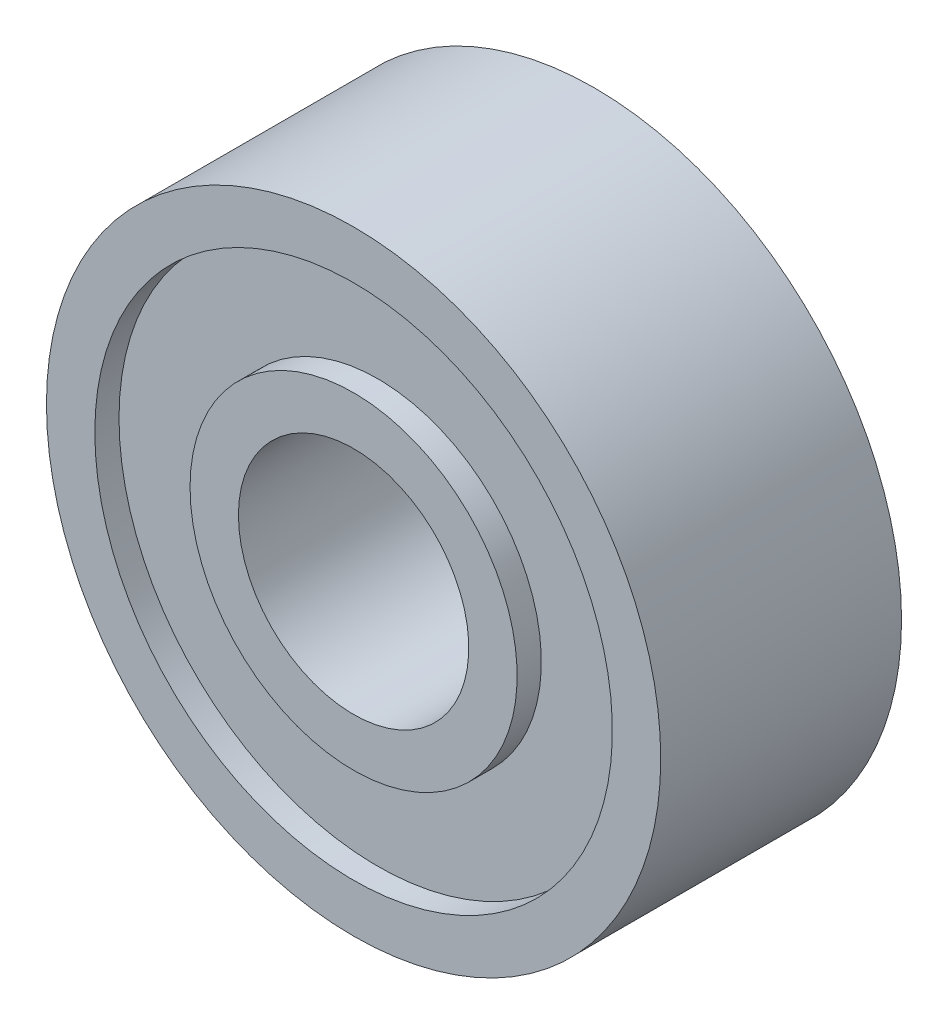
ISO-10303-21;
HEADER;
FILE_DESCRIPTION(('STEP AP214'),'2;1');
FILE_NAME('part.step','',(''),(''),'','','');
FILE_SCHEMA(('AUTOMOTIVE_DESIGN { 1 0 10303 214 1 1 1 1 }'));
ENDSEC;
DATA;
#1=APPLICATION_CONTEXT('core data for automotive mechanical design processes');
#2=APPLICATION_PROTOCOL_DEFINITION('international standard','automotive_design',2000,#1);
#3=PRODUCT_CONTEXT('',#1,'mechanical');
#4=PRODUCT('Part','Part','',(#3));
#5=PRODUCT_RELATED_PRODUCT_CATEGORY('part','',(#4));
#6=PRODUCT_DEFINITION_FORMATION('','',#4);
#7=PRODUCT_DEFINITION_CONTEXT('part definition',#1,'design');
#8=PRODUCT_DEFINITION('design','',#6,#7);
#9=PRODUCT_DEFINITION_SHAPE('','',#8);
#10=(LENGTH_UNIT() NAMED_UNIT(*) SI_UNIT(.MILLI.,.METRE.));
#11=(NAMED_UNIT(*) PLANE_ANGLE_UNIT() SI_UNIT($,.RADIAN.));
#12=(NAMED_UNIT(*) SI_UNIT($,.STERADIAN.) SOLID_ANGLE_UNIT());
#13=UNCERTAINTY_MEASURE_WITH_UNIT(LENGTH_MEASURE(1.E-05),#10,'distance_accuracy_value','');
#14=(GEOMETRIC_REPRESENTATION_CONTEXT(3) GLOBAL_UNCERTAINTY_ASSIGNED_CONTEXT((#13)) GLOBAL_UNIT_ASSIGNED_CONTEXT((#10,
#11,#12)) REPRESENTATION_CONTEXT('',''));
#15=CARTESIAN_POINT('',(0.,0.,0.));
#16=DIRECTION('',(0.,0.,1.));
#17=DIRECTION('',(1.,0.,0.));
#18=AXIS2_PLACEMENT_3D('',#15,#16,#17);
#19=CARTESIAN_POINT('',(0.,0.,2.48919999999999));
#20=DIRECTION('',(0.,0.,-1.));
#21=DIRECTION('',(-1.,0.,0.));
#22=AXIS2_PLACEMENT_3D('',#19,#20,#21);
#23=CYLINDRICAL_SURFACE('',#22,3.38125);
#24=CARTESIAN_POINT('',(0.,0.,2.48919999999999));
#25=DIRECTION('',(0.,0.,-1.));
#26=DIRECTION('',(-1.,0.,0.));
#27=AXIS2_PLACEMENT_3D('',#24,#25,#26);
#28=CIRCLE('',#27,3.38125);
#29=CARTESIAN_POINT('',(-3.38125,0.,2.48919999999999));
#30=VERTEX_POINT('',#29);
#31=EDGE_CURVE('E10',#30,#30,#28,.T.);
#32=ORIENTED_EDGE('',*,*,#31,.T.);
#33=EDGE_LOOP('',(#32));
#34=FACE_BOUND('',#33,.T.);
#35=CARTESIAN_POINT('',(0.,0.,1.98920000000001));
#36=DIRECTION('',(0.,0.,-1.));
#37=DIRECTION('',(-1.,0.,0.));
#38=AXIS2_PLACEMENT_3D('',#35,#36,#37);
#39=CIRCLE('',#38,3.38125);
#40=CARTESIAN_POINT('',(-3.38125,0.,1.98920000000001));
#41=VERTEX_POINT('',#40);
#42=EDGE_CURVE('E73',#41,#41,#39,.T.);
#43=ORIENTED_EDGE('',*,*,#42,.F.);
#44=EDGE_LOOP('',(#43));
#45=FACE_BOUND('',#44,.T.);
#46=ADVANCED_FACE('F33',(#34,#45),#23,.T.);
#47=CARTESIAN_POINT('',(3.38125,0.,2.48919999999999));
#48=DIRECTION('',(0.,0.,1.));
#49=DIRECTION('',(1.,0.,0.));
#50=AXIS2_PLACEMENT_3D('',#47,#48,#49);
#51=PLANE('',#50);
#52=CARTESIAN_POINT('',(0.,0.,2.48919999999999));
#53=DIRECTION('',(0.,0.,-1.));
#54=DIRECTION('',(-1.,0.,0.));
#55=AXIS2_PLACEMENT_3D('',#52,#53,#54);
#56=CIRCLE('',#55,2.38125);
#57=CARTESIAN_POINT('',(-2.38125,0.,2.48919999999999));
#58=VERTEX_POINT('',#57);
#59=EDGE_CURVE('E39',#58,#58,#56,.T.);
#60=ORIENTED_EDGE('',*,*,#59,.T.);
#61=EDGE_LOOP('',(#60));
#62=FACE_BOUND('',#61,.T.);
#63=ORIENTED_EDGE('',*,*,#31,.F.);
#64=EDGE_LOOP('',(#63));
#65=FACE_BOUND('',#64,.T.);
#66=ADVANCED_FACE('F81',(#62,#65),#51,.T.);
#67=CARTESIAN_POINT('',(0.,0.,2.48919999999999));
#68=DIRECTION('',(0.,0.,-1.));
#69=DIRECTION('',(-1.,0.,0.));
#70=AXIS2_PLACEMENT_3D('',#67,#68,#69);
#71=CYLINDRICAL_SURFACE('',#70,2.38125);
#72=CARTESIAN_POINT('',(0.,0.,-2.4892));
#73=DIRECTION('',(0.,0.,-1.));
#74=DIRECTION('',(-1.,0.,0.));
#75=AXIS2_PLACEMENT_3D('',#72,#73,#74);
#76=CIRCLE('',#75,2.38125);
#77=CARTESIAN_POINT('',(-2.38125,0.,-2.4892));
#78=VERTEX_POINT('',#77);
#79=EDGE_CURVE('E43',#78,#78,#76,.T.);
#80=ORIENTED_EDGE('',*,*,#79,.T.);
#81=EDGE_LOOP('',(#80));
#82=FACE_BOUND('',#81,.T.);
#83=ORIENTED_EDGE('',*,*,#59,.F.);
#84=EDGE_LOOP('',(#83));
#85=FACE_BOUND('',#84,.T.);
#86=ADVANCED_FACE('F85',(#82,#85),#71,.F.);
#87=CARTESIAN_POINT('',(2.38125,0.,-2.4892));
#88=DIRECTION('',(0.,0.,-1.));
#89=DIRECTION('',(-1.,0.,0.));
#90=AXIS2_PLACEMENT_3D('',#87,#88,#89);
#91=PLANE('',#90);
#92=CARTESIAN_POINT('',(0.,0.,-2.4892));
#93=DIRECTION('',(0.,0.,-1.));
#94=DIRECTION('',(-1.,0.,0.));
#95=AXIS2_PLACEMENT_3D('',#92,#93,#94);
#96=CIRCLE('',#95,3.38125);
#97=CARTESIAN_POINT('',(-3.38125,0.,-2.4892));
#98=VERTEX_POINT('',#97);
#99=EDGE_CURVE('E47',#98,#98,#96,.T.);
#100=ORIENTED_EDGE('',*,*,#99,.T.);
#101=EDGE_LOOP('',(#100));
#102=FACE_BOUND('',#101,.T.);
#103=ORIENTED_EDGE('',*,*,#79,.F.);
#104=EDGE_LOOP('',(#103));
#105=FACE_BOUND('',#104,.T.);
#106=ADVANCED_FACE('F89',(#102,#105),#91,.T.);
#107=CARTESIAN_POINT('',(0.,0.,2.48919999999999));
#108=DIRECTION('',(0.,0.,-1.));
#109=DIRECTION('',(-1.,0.,0.));
#110=AXIS2_PLACEMENT_3D('',#107,#108,#109);
#111=CYLINDRICAL_SURFACE('',#110,3.38125);
#112=CARTESIAN_POINT('',(0.,0.,-1.9892));
#113=DIRECTION('',(0.,0.,-1.));
#114=DIRECTION('',(-1.,0.,0.));
#115=AXIS2_PLACEMENT_3D('',#112,#113,#114);
#116=CIRCLE('',#115,3.38125);
#117=CARTESIAN_POINT('',(-3.38125,0.,-1.9892));
#118=VERTEX_POINT('',#117);
#119=EDGE_CURVE('E52',#118,#118,#116,.T.);
#120=ORIENTED_EDGE('',*,*,#119,.T.);
#121=EDGE_LOOP('',(#120));
#122=FACE_BOUND('',#121,.T.);
#123=ORIENTED_EDGE('',*,*,#99,.F.);
#124=EDGE_LOOP('',(#123));
#125=FACE_BOUND('',#124,.T.);
#126=ADVANCED_FACE('F96',(#122,#125),#111,.T.);
#127=CARTESIAN_POINT('',(3.38125,0.,-1.9892));
#128=DIRECTION('',(0.,0.,-1.));
#129=DIRECTION('',(-1.,0.,0.));
#130=AXIS2_PLACEMENT_3D('',#127,#128,#129);
#131=PLANE('',#130);
#132=CARTESIAN_POINT('',(0.,0.,-1.9892));
#133=DIRECTION('',(0.,0.,-1.));
#134=DIRECTION('',(-1.,0.,0.));
#135=AXIS2_PLACEMENT_3D('',#132,#133,#134);
#136=CIRCLE('',#135,5.35);
#137=CARTESIAN_POINT('',(-5.35,0.,-1.9892));
#138=VERTEX_POINT('',#137);
#139=EDGE_CURVE('E55',#138,#138,#136,.T.);
#140=ORIENTED_EDGE('',*,*,#139,.T.);
#141=EDGE_LOOP('',(#140));
#142=FACE_BOUND('',#141,.T.);
#143=ORIENTED_EDGE('',*,*,#119,.F.);
#144=EDGE_LOOP('',(#143));
#145=FACE_BOUND('',#144,.T.);
#146=ADVANCED_FACE('F100',(#142,#145),#131,.T.);
#147=CARTESIAN_POINT('',(0.,0.,2.48919999999999));
#148=DIRECTION('',(0.,0.,-1.));
#149=DIRECTION('',(-1.,0.,0.));
#150=AXIS2_PLACEMENT_3D('',#147,#148,#149);
#151=CYLINDRICAL_SURFACE('',#150,5.35);
#152=CARTESIAN_POINT('',(0.,0.,-2.4892));
#153=DIRECTION('',(0.,0.,-1.));
#154=DIRECTION('',(-1.,0.,0.));
#155=AXIS2_PLACEMENT_3D('',#152,#153,#154);
#156=CIRCLE('',#155,5.35);
#157=CARTESIAN_POINT('',(-5.35,0.,-2.4892));
#158=VERTEX_POINT('',#157);
#159=EDGE_CURVE('E58',#158,#158,#156,.T.);
#160=ORIENTED_EDGE('',*,*,#159,.T.);
#161=EDGE_LOOP('',(#160));
#162=FACE_BOUND('',#161,.T.);
#163=ORIENTED_EDGE('',*,*,#139,.F.);
#164=EDGE_LOOP('',(#163));
#165=FACE_BOUND('',#164,.T.);
#166=ADVANCED_FACE('F104',(#162,#165),#151,.F.);
#167=CARTESIAN_POINT('',(5.35,0.,-2.4892));
#168=DIRECTION('',(0.,0.,-1.));
#169=DIRECTION('',(-1.,0.,0.));
#170=AXIS2_PLACEMENT_3D('',#167,#168,#169);
#171=PLANE('',#170);
#172=CARTESIAN_POINT('',(0.,0.,-2.4892));
#173=DIRECTION('',(0.,0.,-1.));
#174=DIRECTION('',(-1.,0.,0.));
#175=AXIS2_PLACEMENT_3D('',#172,#173,#174);
#176=CIRCLE('',#175,6.35);
#177=CARTESIAN_POINT('',(-6.35,0.,-2.4892));
#178=VERTEX_POINT('',#177);
#179=EDGE_CURVE('E61',#178,#178,#176,.T.);
#180=ORIENTED_EDGE('',*,*,#179,.T.);
#181=EDGE_LOOP('',(#180));
#182=FACE_BOUND('',#181,.T.);
#183=ORIENTED_EDGE('',*,*,#159,.F.);
#184=EDGE_LOOP('',(#183));
#185=FACE_BOUND('',#184,.T.);
#186=ADVANCED_FACE('F108',(#182,#185),#171,.T.);
#187=CARTESIAN_POINT('',(0.,0.,2.48919999999999));
#188=DIRECTION('',(0.,0.,-1.));
#189=DIRECTION('',(-1.,0.,0.));
#190=AXIS2_PLACEMENT_3D('',#187,#188,#189);
#191=CYLINDRICAL_SURFACE('',#190,6.35);
#192=CARTESIAN_POINT('',(0.,0.,2.48919999999999));
#193=DIRECTION('',(0.,0.,-1.));
#194=DIRECTION('',(-1.,0.,0.));
#195=AXIS2_PLACEMENT_3D('',#192,#193,#194);
#196=CIRCLE('',#195,6.35);
#197=CARTESIAN_POINT('',(-6.35,0.,2.48919999999999));
#198=VERTEX_POINT('',#197);
#199=EDGE_CURVE('E64',#198,#198,#196,.T.);
#200=ORIENTED_EDGE('',*,*,#199,.T.);
#201=EDGE_LOOP('',(#200));
#202=FACE_BOUND('',#201,.T.);
#203=ORIENTED_EDGE('',*,*,#179,.F.);
#204=EDGE_LOOP('',(#203));
#205=FACE_BOUND('',#204,.T.);
#206=ADVANCED_FACE('F112',(#202,#205),#191,.T.);
#207=CARTESIAN_POINT('',(6.35,0.,2.48919999999999));
#208=DIRECTION('',(0.,0.,1.));
#209=DIRECTION('',(1.,0.,0.));
#210=AXIS2_PLACEMENT_3D('',#207,#208,#209);
#211=PLANE('',#210);
#212=CARTESIAN_POINT('',(0.,0.,2.48919999999999));
#213=DIRECTION('',(0.,0.,-1.));
#214=DIRECTION('',(-1.,0.,0.));
#215=AXIS2_PLACEMENT_3D('',#212,#213,#214);
#216=CIRCLE('',#215,5.35);
#217=CARTESIAN_POINT('',(-5.35,0.,2.48919999999999));
#218=VERTEX_POINT('',#217);
#219=EDGE_CURVE('E67',#218,#218,#216,.T.);
#220=ORIENTED_EDGE('',*,*,#219,.T.);
#221=EDGE_LOOP('',(#220));
#222=FACE_BOUND('',#221,.T.);
#223=ORIENTED_EDGE('',*,*,#199,.F.);
#224=EDGE_LOOP('',(#223));
#225=FACE_BOUND('',#224,.T.);
#226=ADVANCED_FACE('F116',(#222,#225),#211,.T.);
#227=CARTESIAN_POINT('',(0.,0.,2.48919999999999));
#228=DIRECTION('',(0.,0.,-1.));
#229=DIRECTION('',(-1.,0.,0.));
#230=AXIS2_PLACEMENT_3D('',#227,#228,#229);
#231=CYLINDRICAL_SURFACE('',#230,5.35);
#232=CARTESIAN_POINT('',(0.,0.,1.98919999999999));
#233=DIRECTION('',(0.,0.,-1.));
#234=DIRECTION('',(-1.,0.,0.));
#235=AXIS2_PLACEMENT_3D('',#232,#233,#234);
#236=CIRCLE('',#235,5.35);
#237=CARTESIAN_POINT('',(-5.35,0.,1.98919999999999));
#238=VERTEX_POINT('',#237);
#239=EDGE_CURVE('E70',#238,#238,#236,.T.);
#240=ORIENTED_EDGE('',*,*,#239,.T.);
#241=EDGE_LOOP('',(#240));
#242=FACE_BOUND('',#241,.T.);
#243=ORIENTED_EDGE('',*,*,#219,.F.);
#244=EDGE_LOOP('',(#243));
#245=FACE_BOUND('',#244,.T.);
#246=ADVANCED_FACE('F120',(#242,#245),#231,.F.);
#247=CARTESIAN_POINT('',(5.35,0.,1.9892));
#248=DIRECTION('',(0.,0.,1.));
#249=DIRECTION('',(1.,0.,0.));
#250=AXIS2_PLACEMENT_3D('',#247,#248,#249);
#251=PLANE('',#250);
#252=ORIENTED_EDGE('',*,*,#42,.T.);
#253=EDGE_LOOP('',(#252));
#254=FACE_BOUND('',#253,.T.);
#255=ORIENTED_EDGE('',*,*,#239,.F.);
#256=EDGE_LOOP('',(#255));
#257=FACE_BOUND('',#256,.T.);
#258=ADVANCED_FACE('F77',(#254,#257),#251,.T.);
#259=CLOSED_SHELL('',(#46,#66,#86,#106,#126,#146,#166,#186,#206,#226,#246,#258));
#260=MANIFOLD_SOLID_BREP('B2',#259);
#261=ADVANCED_BREP_SHAPE_REPRESENTATION('',(#18,#260),#14);
#262=SHAPE_DEFINITION_REPRESENTATION(#9,#261);
ENDSEC;
END-ISO-10303-21;
